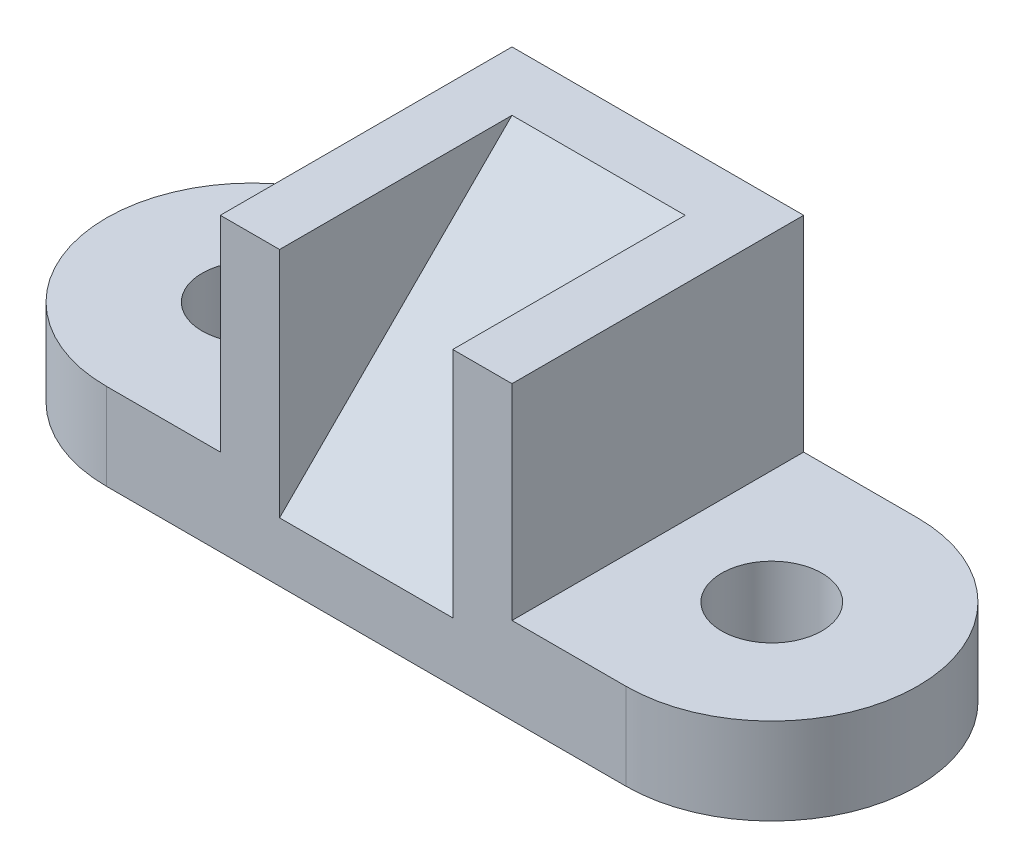
ISO-10303-21;
HEADER;
FILE_DESCRIPTION(('STEP AP214'),'2;1');
FILE_NAME('part.step','',(''),(''),'','','');
FILE_SCHEMA(('AUTOMOTIVE_DESIGN { 1 0 10303 214 1 1 1 1 }'));
ENDSEC;
DATA;
#1=APPLICATION_CONTEXT('core data for automotive mechanical design processes');
#2=APPLICATION_PROTOCOL_DEFINITION('international standard','automotive_design',2000,#1);
#3=PRODUCT_CONTEXT('',#1,'mechanical');
#4=PRODUCT('Part','Part','',(#3));
#5=PRODUCT_RELATED_PRODUCT_CATEGORY('part','',(#4));
#6=PRODUCT_DEFINITION_FORMATION('','',#4);
#7=PRODUCT_DEFINITION_CONTEXT('part definition',#1,'design');
#8=PRODUCT_DEFINITION('design','',#6,#7);
#9=PRODUCT_DEFINITION_SHAPE('','',#8);
#10=(LENGTH_UNIT() NAMED_UNIT(*) SI_UNIT(.MILLI.,.METRE.));
#11=(NAMED_UNIT(*) PLANE_ANGLE_UNIT() SI_UNIT($,.RADIAN.));
#12=(NAMED_UNIT(*) SI_UNIT($,.STERADIAN.) SOLID_ANGLE_UNIT());
#13=UNCERTAINTY_MEASURE_WITH_UNIT(LENGTH_MEASURE(1.E-05),#10,'distance_accuracy_value','');
#14=(GEOMETRIC_REPRESENTATION_CONTEXT(3) GLOBAL_UNCERTAINTY_ASSIGNED_CONTEXT((#13)) GLOBAL_UNIT_ASSIGNED_CONTEXT((#10,
#11,#12)) REPRESENTATION_CONTEXT('',''));
#15=CARTESIAN_POINT('',(0.,0.,0.));
#16=DIRECTION('',(0.,0.,1.));
#17=DIRECTION('',(1.,0.,0.));
#18=AXIS2_PLACEMENT_3D('',#15,#16,#17);
#19=CARTESIAN_POINT('',(57.,19.,0.));
#20=DIRECTION('',(0.,1.,0.));
#21=DIRECTION('',(0.,0.,1.));
#22=AXIS2_PLACEMENT_3D('',#19,#20,#21);
#23=PLANE('',#22);
#24=DIRECTION('',(0.,0.,-1.));
#25=VECTOR('',#24,1.);
#26=CARTESIAN_POINT('',(32.,19.,-32.));
#27=LINE('',#26,#25);
#28=CARTESIAN_POINT('',(32.,19.,32.));
#29=VERTEX_POINT('',#28);
#30=CARTESIAN_POINT('',(32.,19.,-32.));
#31=VERTEX_POINT('',#30);
#32=EDGE_CURVE('E69',#29,#31,#27,.T.);
#33=ORIENTED_EDGE('',*,*,#32,.F.);
#34=DIRECTION('',(1.,0.,0.));
#35=VECTOR('',#34,1.);
#36=CARTESIAN_POINT('',(-57.,19.,32.));
#37=LINE('',#36,#35);
#38=CARTESIAN_POINT('',(57.,19.,32.));
#39=VERTEX_POINT('',#38);
#40=EDGE_CURVE('E231',#29,#39,#37,.T.);
#41=ORIENTED_EDGE('',*,*,#40,.T.);
#42=CARTESIAN_POINT('',(57.,19.,0.));
#43=DIRECTION('',(0.,1.,0.));
#44=DIRECTION('',(0.,0.,1.));
#45=AXIS2_PLACEMENT_3D('',#42,#43,#44);
#46=CIRCLE('',#45,32.);
#47=CARTESIAN_POINT('',(57.,19.,-32.));
#48=VERTEX_POINT('',#47);
#49=EDGE_CURVE('E219',#39,#48,#46,.T.);
#50=ORIENTED_EDGE('',*,*,#49,.T.);
#51=DIRECTION('',(-1.,0.,0.));
#52=VECTOR('',#51,1.);
#53=CARTESIAN_POINT('',(-57.,19.,-32.));
#54=LINE('',#53,#52);
#55=EDGE_CURVE('E225',#48,#31,#54,.T.);
#56=ORIENTED_EDGE('',*,*,#55,.T.);
#57=EDGE_LOOP('',(#33,#41,#50,#56));
#58=FACE_BOUND('',#57,.T.);
#59=CARTESIAN_POINT('',(57.,19.,0.));
#60=DIRECTION('',(0.,1.,0.));
#61=DIRECTION('',(0.,0.,1.));
#62=AXIS2_PLACEMENT_3D('',#59,#60,#61);
#63=CIRCLE('',#62,11.);
#64=CARTESIAN_POINT('',(57.,19.,11.));
#65=VERTEX_POINT('',#64);
#66=EDGE_CURVE('E203',#65,#65,#63,.T.);
#67=ORIENTED_EDGE('',*,*,#66,.F.);
#68=EDGE_LOOP('',(#67));
#69=FACE_BOUND('',#68,.T.);
#70=ADVANCED_FACE('F45',(#58,#69),#23,.T.);
#71=DIRECTION('',(0.,0.,1.));
#72=VECTOR('',#71,1.);
#73=CARTESIAN_POINT('',(-32.,19.,-32.));
#74=LINE('',#73,#72);
#75=CARTESIAN_POINT('',(-32.,19.,-32.));
#76=VERTEX_POINT('',#75);
#77=CARTESIAN_POINT('',(-32.,19.,32.));
#78=VERTEX_POINT('',#77);
#79=EDGE_CURVE('E172',#76,#78,#74,.T.);
#80=ORIENTED_EDGE('',*,*,#79,.F.);
#81=CARTESIAN_POINT('',(-57.,19.,-32.));
#82=VERTEX_POINT('',#81);
#83=EDGE_CURVE('E223',#76,#82,#54,.T.);
#84=ORIENTED_EDGE('',*,*,#83,.T.);
#85=CARTESIAN_POINT('',(-57.,19.,0.));
#86=DIRECTION('',(0.,1.,0.));
#87=DIRECTION('',(0.,0.,1.));
#88=AXIS2_PLACEMENT_3D('',#85,#86,#87);
#89=CIRCLE('',#88,32.);
#90=CARTESIAN_POINT('',(-57.,19.,32.));
#91=VERTEX_POINT('',#90);
#92=EDGE_CURVE('E228',#82,#91,#89,.T.);
#93=ORIENTED_EDGE('',*,*,#92,.T.);
#94=EDGE_CURVE('E232',#91,#78,#37,.T.);
#95=ORIENTED_EDGE('',*,*,#94,.T.);
#96=EDGE_LOOP('',(#80,#84,#93,#95));
#97=FACE_BOUND('',#96,.T.);
#98=CARTESIAN_POINT('',(-57.,19.,0.));
#99=DIRECTION('',(0.,1.,0.));
#100=DIRECTION('',(0.,0.,1.));
#101=AXIS2_PLACEMENT_3D('',#98,#99,#100);
#102=CIRCLE('',#101,11.);
#103=CARTESIAN_POINT('',(-57.,19.,11.));
#104=VERTEX_POINT('',#103);
#105=EDGE_CURVE('E211',#104,#104,#102,.T.);
#106=ORIENTED_EDGE('',*,*,#105,.F.);
#107=EDGE_LOOP('',(#106));
#108=FACE_BOUND('',#107,.T.);
#109=ADVANCED_FACE('F300',(#97,#108),#23,.T.);
#110=CARTESIAN_POINT('',(57.,0.,0.));
#111=DIRECTION('',(0.,1.,0.));
#112=DIRECTION('',(0.,0.,1.));
#113=AXIS2_PLACEMENT_3D('',#110,#111,#112);
#114=PLANE('',#113);
#115=CARTESIAN_POINT('',(57.,0.,0.));
#116=DIRECTION('',(0.,1.,0.));
#117=DIRECTION('',(0.,0.,1.));
#118=AXIS2_PLACEMENT_3D('',#115,#116,#117);
#119=CIRCLE('',#118,32.);
#120=CARTESIAN_POINT('',(57.,0.,32.));
#121=VERTEX_POINT('',#120);
#122=CARTESIAN_POINT('',(57.,0.,-32.));
#123=VERTEX_POINT('',#122);
#124=EDGE_CURVE('E215',#121,#123,#119,.T.);
#125=ORIENTED_EDGE('',*,*,#124,.F.);
#126=DIRECTION('',(1.,0.,0.));
#127=VECTOR('',#126,1.);
#128=CARTESIAN_POINT('',(-57.,0.,32.));
#129=LINE('',#128,#127);
#130=CARTESIAN_POINT('',(-57.,0.,32.));
#131=VERTEX_POINT('',#130);
#132=EDGE_CURVE('E224',#131,#121,#129,.T.);
#133=ORIENTED_EDGE('',*,*,#132,.F.);
#134=CARTESIAN_POINT('',(-57.,0.,0.));
#135=DIRECTION('',(0.,1.,0.));
#136=DIRECTION('',(0.,0.,1.));
#137=AXIS2_PLACEMENT_3D('',#134,#135,#136);
#138=CIRCLE('',#137,32.);
#139=CARTESIAN_POINT('',(-57.,0.,-32.));
#140=VERTEX_POINT('',#139);
#141=EDGE_CURVE('E242',#140,#131,#138,.T.);
#142=ORIENTED_EDGE('',*,*,#141,.F.);
#143=DIRECTION('',(-1.,0.,0.));
#144=VECTOR('',#143,1.);
#145=CARTESIAN_POINT('',(-57.,0.,-32.));
#146=LINE('',#145,#144);
#147=EDGE_CURVE('E239',#123,#140,#146,.T.);
#148=ORIENTED_EDGE('',*,*,#147,.F.);
#149=EDGE_LOOP('',(#125,#133,#142,#148));
#150=FACE_BOUND('',#149,.T.);
#151=CARTESIAN_POINT('',(-57.,0.,0.));
#152=DIRECTION('',(0.,1.,0.));
#153=DIRECTION('',(0.,0.,1.));
#154=AXIS2_PLACEMENT_3D('',#151,#152,#153);
#155=CIRCLE('',#154,11.);
#156=CARTESIAN_POINT('',(-57.,0.,11.));
#157=VERTEX_POINT('',#156);
#158=EDGE_CURVE('E207',#157,#157,#155,.T.);
#159=ORIENTED_EDGE('',*,*,#158,.T.);
#160=EDGE_LOOP('',(#159));
#161=FACE_BOUND('',#160,.T.);
#162=CARTESIAN_POINT('',(57.,0.,0.));
#163=DIRECTION('',(0.,1.,0.));
#164=DIRECTION('',(0.,0.,1.));
#165=AXIS2_PLACEMENT_3D('',#162,#163,#164);
#166=CIRCLE('',#165,11.);
#167=CARTESIAN_POINT('',(57.,0.,11.));
#168=VERTEX_POINT('',#167);
#169=EDGE_CURVE('E202',#168,#168,#166,.T.);
#170=ORIENTED_EDGE('',*,*,#169,.T.);
#171=EDGE_LOOP('',(#170));
#172=FACE_BOUND('',#171,.T.);
#173=ADVANCED_FACE('F266',(#150,#161,#172),#114,.F.);
#174=CARTESIAN_POINT('',(57.,19.,0.));
#175=DIRECTION('',(0.,-1.,0.));
#176=DIRECTION('',(0.,0.,-1.));
#177=AXIS2_PLACEMENT_3D('',#174,#175,#176);
#178=CYLINDRICAL_SURFACE('',#177,32.);
#179=ORIENTED_EDGE('',*,*,#124,.T.);
#180=DIRECTION('',(0.,-1.,0.));
#181=VECTOR('',#180,1.);
#182=CARTESIAN_POINT('',(57.,19.,-32.));
#183=LINE('',#182,#181);
#184=EDGE_CURVE('E11',#48,#123,#183,.T.);
#185=ORIENTED_EDGE('',*,*,#184,.F.);
#186=ORIENTED_EDGE('',*,*,#49,.F.);
#187=DIRECTION('',(0.,-1.,0.));
#188=VECTOR('',#187,1.);
#189=CARTESIAN_POINT('',(57.,19.,32.));
#190=LINE('',#189,#188);
#191=EDGE_CURVE('E235',#39,#121,#190,.T.);
#192=ORIENTED_EDGE('',*,*,#191,.T.);
#193=EDGE_LOOP('',(#179,#185,#186,#192));
#194=FACE_BOUND('',#193,.T.);
#195=ADVANCED_FACE('F47',(#194),#178,.T.);
#196=CARTESIAN_POINT('',(-57.,19.,-32.));
#197=DIRECTION('',(0.,0.,1.));
#198=DIRECTION('',(1.,0.,0.));
#199=AXIS2_PLACEMENT_3D('',#196,#197,#198);
#200=PLANE('',#199);
#201=ORIENTED_EDGE('',*,*,#147,.T.);
#202=DIRECTION('',(0.,-1.,0.));
#203=VECTOR('',#202,1.);
#204=CARTESIAN_POINT('',(-57.,19.,-32.));
#205=LINE('',#204,#203);
#206=EDGE_CURVE('E54',#82,#140,#205,.T.);
#207=ORIENTED_EDGE('',*,*,#206,.F.);
#208=ORIENTED_EDGE('',*,*,#83,.F.);
#209=DIRECTION('',(0.,-1.,0.));
#210=VECTOR('',#209,1.);
#211=CARTESIAN_POINT('',(-32.,64.,-32.));
#212=LINE('',#211,#210);
#213=CARTESIAN_POINT('',(-32.,64.,-32.));
#214=VERTEX_POINT('',#213);
#215=EDGE_CURVE('E194',#214,#76,#212,.T.);
#216=ORIENTED_EDGE('',*,*,#215,.F.);
#217=DIRECTION('',(-1.,0.,0.));
#218=VECTOR('',#217,1.);
#219=CARTESIAN_POINT('',(-32.,64.,-32.));
#220=LINE('',#219,#218);
#221=CARTESIAN_POINT('',(32.,64.,-32.));
#222=VERTEX_POINT('',#221);
#223=EDGE_CURVE('E171',#222,#214,#220,.T.);
#224=ORIENTED_EDGE('',*,*,#223,.F.);
#225=DIRECTION('',(0.,-1.,0.));
#226=VECTOR('',#225,1.);
#227=CARTESIAN_POINT('',(32.,64.,-32.));
#228=LINE('',#227,#226);
#229=EDGE_CURVE('E198',#222,#31,#228,.T.);
#230=ORIENTED_EDGE('',*,*,#229,.T.);
#231=ORIENTED_EDGE('',*,*,#55,.F.);
#232=ORIENTED_EDGE('',*,*,#184,.T.);
#233=EDGE_LOOP('',(#201,#207,#208,#216,#224,#230,#231,#232));
#234=FACE_BOUND('',#233,.T.);
#235=ADVANCED_FACE('F285',(#234),#200,.F.);
#236=CARTESIAN_POINT('',(-57.,19.,0.));
#237=DIRECTION('',(0.,-1.,0.));
#238=DIRECTION('',(0.,0.,-1.));
#239=AXIS2_PLACEMENT_3D('',#236,#237,#238);
#240=CYLINDRICAL_SURFACE('',#239,32.);
#241=ORIENTED_EDGE('',*,*,#141,.T.);
#242=DIRECTION('',(0.,-1.,0.));
#243=VECTOR('',#242,1.);
#244=CARTESIAN_POINT('',(-57.,19.,32.));
#245=LINE('',#244,#243);
#246=EDGE_CURVE('E250',#91,#131,#245,.T.);
#247=ORIENTED_EDGE('',*,*,#246,.F.);
#248=ORIENTED_EDGE('',*,*,#92,.F.);
#249=ORIENTED_EDGE('',*,*,#206,.T.);
#250=EDGE_LOOP('',(#241,#247,#248,#249));
#251=FACE_BOUND('',#250,.T.);
#252=ADVANCED_FACE('F259',(#251),#240,.T.);
#253=CARTESIAN_POINT('',(-57.,19.,32.));
#254=DIRECTION('',(0.,0.,-1.));
#255=DIRECTION('',(-1.,0.,0.));
#256=AXIS2_PLACEMENT_3D('',#253,#254,#255);
#257=PLANE('',#256);
#258=DIRECTION('',(1.,0.,0.));
#259=VECTOR('',#258,1.);
#260=CARTESIAN_POINT('',(-19.,13.,32.));
#261=LINE('',#260,#259);
#262=CARTESIAN_POINT('',(-19.,13.,32.));
#263=VERTEX_POINT('',#262);
#264=CARTESIAN_POINT('',(19.,13.,32.));
#265=VERTEX_POINT('',#264);
#266=EDGE_CURVE('E139',#263,#265,#261,.T.);
#267=ORIENTED_EDGE('',*,*,#266,.F.);
#268=DIRECTION('',(0.,-1.,0.));
#269=VECTOR('',#268,1.);
#270=CARTESIAN_POINT('',(-19.,13.,32.));
#271=LINE('',#270,#269);
#272=CARTESIAN_POINT('',(-19.,64.,32.));
#273=VERTEX_POINT('',#272);
#274=EDGE_CURVE('E140',#273,#263,#271,.T.);
#275=ORIENTED_EDGE('',*,*,#274,.F.);
#276=DIRECTION('',(1.,0.,0.));
#277=VECTOR('',#276,1.);
#278=CARTESIAN_POINT('',(-32.,64.,32.));
#279=LINE('',#278,#277);
#280=CARTESIAN_POINT('',(-32.,64.,32.));
#281=VERTEX_POINT('',#280);
#282=EDGE_CURVE('E152',#281,#273,#279,.T.);
#283=ORIENTED_EDGE('',*,*,#282,.F.);
#284=DIRECTION('',(0.,-1.,0.));
#285=VECTOR('',#284,1.);
#286=CARTESIAN_POINT('',(-32.,64.,32.));
#287=LINE('',#286,#285);
#288=EDGE_CURVE('E190',#281,#78,#287,.T.);
#289=ORIENTED_EDGE('',*,*,#288,.T.);
#290=ORIENTED_EDGE('',*,*,#94,.F.);
#291=ORIENTED_EDGE('',*,*,#246,.T.);
#292=ORIENTED_EDGE('',*,*,#132,.T.);
#293=ORIENTED_EDGE('',*,*,#191,.F.);
#294=ORIENTED_EDGE('',*,*,#40,.F.);
#295=DIRECTION('',(0.,-1.,0.));
#296=VECTOR('',#295,1.);
#297=CARTESIAN_POINT('',(32.,64.,32.));
#298=LINE('',#297,#296);
#299=CARTESIAN_POINT('',(32.,64.,32.));
#300=VERTEX_POINT('',#299);
#301=EDGE_CURVE('E181',#300,#29,#298,.T.);
#302=ORIENTED_EDGE('',*,*,#301,.F.);
#303=CARTESIAN_POINT('',(19.,64.,32.));
#304=VERTEX_POINT('',#303);
#305=EDGE_CURVE('E178',#304,#300,#279,.T.);
#306=ORIENTED_EDGE('',*,*,#305,.F.);
#307=DIRECTION('',(0.,-1.,0.));
#308=VECTOR('',#307,1.);
#309=CARTESIAN_POINT('',(19.,13.,32.));
#310=LINE('',#309,#308);
#311=EDGE_CURVE('E61',#304,#265,#310,.T.);
#312=ORIENTED_EDGE('',*,*,#311,.T.);
#313=EDGE_LOOP('',(#267,#275,#283,#289,#290,#291,#292,#293,#294,#302,#306,#312));
#314=FACE_BOUND('',#313,.T.);
#315=ADVANCED_FACE('F270',(#314),#257,.F.);
#316=CARTESIAN_POINT('',(-57.,19.,0.));
#317=DIRECTION('',(0.,-1.,0.));
#318=DIRECTION('',(0.,0.,-1.));
#319=AXIS2_PLACEMENT_3D('',#316,#317,#318);
#320=CYLINDRICAL_SURFACE('',#319,11.);
#321=ORIENTED_EDGE('',*,*,#105,.T.);
#322=EDGE_LOOP('',(#321));
#323=FACE_BOUND('',#322,.T.);
#324=ORIENTED_EDGE('',*,*,#158,.F.);
#325=EDGE_LOOP('',(#324));
#326=FACE_BOUND('',#325,.T.);
#327=ADVANCED_FACE('F309',(#323,#326),#320,.F.);
#328=CARTESIAN_POINT('',(57.,19.,0.));
#329=DIRECTION('',(0.,-1.,0.));
#330=DIRECTION('',(0.,0.,-1.));
#331=AXIS2_PLACEMENT_3D('',#328,#329,#330);
#332=CYLINDRICAL_SURFACE('',#331,11.);
#333=ORIENTED_EDGE('',*,*,#66,.T.);
#334=EDGE_LOOP('',(#333));
#335=FACE_BOUND('',#334,.T.);
#336=ORIENTED_EDGE('',*,*,#169,.F.);
#337=EDGE_LOOP('',(#336));
#338=FACE_BOUND('',#337,.T.);
#339=ADVANCED_FACE('F338',(#335,#338),#332,.F.);
#340=CARTESIAN_POINT('',(32.,64.,-32.));
#341=DIRECTION('',(-1.,0.,0.));
#342=DIRECTION('',(0.,0.,1.));
#343=AXIS2_PLACEMENT_3D('',#340,#341,#342);
#344=PLANE('',#343);
#345=ORIENTED_EDGE('',*,*,#32,.T.);
#346=ORIENTED_EDGE('',*,*,#229,.F.);
#347=DIRECTION('',(0.,0.,-1.));
#348=VECTOR('',#347,1.);
#349=CARTESIAN_POINT('',(32.,64.,-32.));
#350=LINE('',#349,#348);
#351=EDGE_CURVE('E167',#300,#222,#350,.T.);
#352=ORIENTED_EDGE('',*,*,#351,.F.);
#353=ORIENTED_EDGE('',*,*,#301,.T.);
#354=EDGE_LOOP('',(#345,#346,#352,#353));
#355=FACE_BOUND('',#354,.T.);
#356=ADVANCED_FACE('F284',(#355),#344,.F.);
#357=CARTESIAN_POINT('',(-32.,64.,-32.));
#358=DIRECTION('',(1.,0.,0.));
#359=DIRECTION('',(0.,0.,-1.));
#360=AXIS2_PLACEMENT_3D('',#357,#358,#359);
#361=PLANE('',#360);
#362=ORIENTED_EDGE('',*,*,#79,.T.);
#363=ORIENTED_EDGE('',*,*,#288,.F.);
#364=DIRECTION('',(0.,0.,1.));
#365=VECTOR('',#364,1.);
#366=CARTESIAN_POINT('',(-32.,64.,-32.));
#367=LINE('',#366,#365);
#368=EDGE_CURVE('E175',#214,#281,#367,.T.);
#369=ORIENTED_EDGE('',*,*,#368,.F.);
#370=ORIENTED_EDGE('',*,*,#215,.T.);
#371=EDGE_LOOP('',(#362,#363,#369,#370));
#372=FACE_BOUND('',#371,.T.);
#373=ADVANCED_FACE('F290',(#372),#361,.F.);
#374=CARTESIAN_POINT('',(0.,64.,0.));
#375=DIRECTION('',(0.,1.,0.));
#376=DIRECTION('',(0.,0.,1.));
#377=AXIS2_PLACEMENT_3D('',#374,#375,#376);
#378=PLANE('',#377);
#379=DIRECTION('',(0.,0.,1.));
#380=VECTOR('',#379,1.);
#381=CARTESIAN_POINT('',(-19.,64.,32.));
#382=LINE('',#381,#380);
#383=CARTESIAN_POINT('',(-19.,64.,-19.));
#384=VERTEX_POINT('',#383);
#385=EDGE_CURVE('E144',#384,#273,#382,.T.);
#386=ORIENTED_EDGE('',*,*,#385,.F.);
#387=DIRECTION('',(1.,0.,0.));
#388=VECTOR('',#387,1.);
#389=CARTESIAN_POINT('',(-19.,64.,-19.));
#390=LINE('',#389,#388);
#391=CARTESIAN_POINT('',(19.,64.,-19.));
#392=VERTEX_POINT('',#391);
#393=EDGE_CURVE('E130',#384,#392,#390,.T.);
#394=ORIENTED_EDGE('',*,*,#393,.T.);
#395=DIRECTION('',(0.,0.,1.));
#396=VECTOR('',#395,1.);
#397=CARTESIAN_POINT('',(19.,64.,32.));
#398=LINE('',#397,#396);
#399=EDGE_CURVE('E160',#392,#304,#398,.T.);
#400=ORIENTED_EDGE('',*,*,#399,.T.);
#401=ORIENTED_EDGE('',*,*,#305,.T.);
#402=ORIENTED_EDGE('',*,*,#351,.T.);
#403=ORIENTED_EDGE('',*,*,#223,.T.);
#404=ORIENTED_EDGE('',*,*,#368,.T.);
#405=ORIENTED_EDGE('',*,*,#282,.T.);
#406=EDGE_LOOP('',(#386,#394,#400,#401,#402,#403,#404,#405));
#407=FACE_BOUND('',#406,.T.);
#408=ADVANCED_FACE('F150',(#407),#378,.T.);
#409=CARTESIAN_POINT('',(-19.,64.,-19.));
#410=DIRECTION('',(0.,-0.707106781186548,-0.707106781186548));
#411=DIRECTION('',(0.,0.707106781186548,-0.707106781186548));
#412=AXIS2_PLACEMENT_3D('',#409,#410,#411);
#413=PLANE('',#412);
#414=DIRECTION('',(0.,0.707106781186547,-0.707106781186547));
#415=VECTOR('',#414,1.);
#416=CARTESIAN_POINT('',(19.,64.,-19.));
#417=LINE('',#416,#415);
#418=EDGE_CURVE('E135',#265,#392,#417,.T.);
#419=ORIENTED_EDGE('',*,*,#418,.T.);
#420=ORIENTED_EDGE('',*,*,#393,.F.);
#421=DIRECTION('',(0.,0.707106781186547,-0.707106781186547));
#422=VECTOR('',#421,1.);
#423=CARTESIAN_POINT('',(-19.,64.,-19.));
#424=LINE('',#423,#422);
#425=EDGE_CURVE('E133',#263,#384,#424,.T.);
#426=ORIENTED_EDGE('',*,*,#425,.F.);
#427=ORIENTED_EDGE('',*,*,#266,.T.);
#428=EDGE_LOOP('',(#419,#420,#426,#427));
#429=FACE_BOUND('',#428,.T.);
#430=ADVANCED_FACE('F132',(#429),#413,.F.);
#431=CARTESIAN_POINT('',(-19.,0.,0.));
#432=DIRECTION('',(-1.,0.,0.));
#433=DIRECTION('',(0.,0.,1.));
#434=AXIS2_PLACEMENT_3D('',#431,#432,#433);
#435=PLANE('',#434);
#436=ORIENTED_EDGE('',*,*,#425,.T.);
#437=ORIENTED_EDGE('',*,*,#385,.T.);
#438=ORIENTED_EDGE('',*,*,#274,.T.);
#439=EDGE_LOOP('',(#436,#437,#438));
#440=FACE_BOUND('',#439,.T.);
#441=ADVANCED_FACE('F143',(#440),#435,.F.);
#442=CARTESIAN_POINT('',(19.,0.,0.));
#443=DIRECTION('',(-1.,0.,0.));
#444=DIRECTION('',(0.,0.,1.));
#445=AXIS2_PLACEMENT_3D('',#442,#443,#444);
#446=PLANE('',#445);
#447=ORIENTED_EDGE('',*,*,#418,.F.);
#448=ORIENTED_EDGE('',*,*,#311,.F.);
#449=ORIENTED_EDGE('',*,*,#399,.F.);
#450=EDGE_LOOP('',(#447,#448,#449));
#451=FACE_BOUND('',#450,.T.);
#452=ADVANCED_FACE('F291',(#451),#446,.T.);
#453=CLOSED_SHELL('',(#70,#109,#173,#195,#235,#252,#315,#327,#339,#356,#373,#408,#430,#441,#452));
#454=MANIFOLD_SOLID_BREP('B2',#453);
#455=ADVANCED_BREP_SHAPE_REPRESENTATION('',(#18,#454),#14);
#456=SHAPE_DEFINITION_REPRESENTATION(#9,#455);
ENDSEC;
END-ISO-10303-21;
